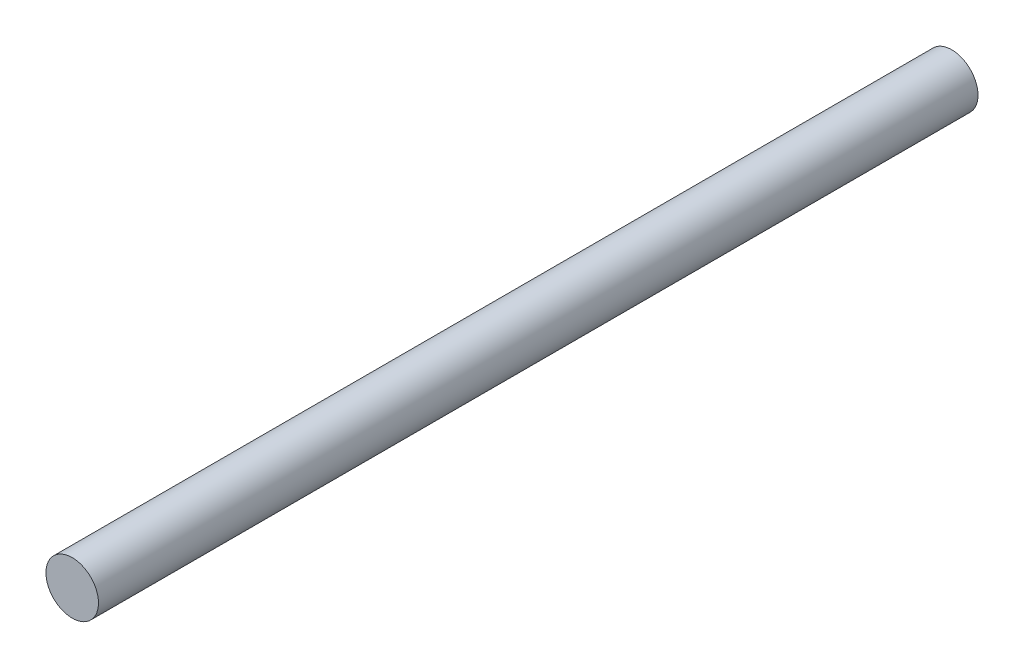
ISO-10303-21;
HEADER;
FILE_DESCRIPTION(('STEP AP214'),'2;1');
FILE_NAME('part.step','',(''),(''),'','','');
FILE_SCHEMA(('AUTOMOTIVE_DESIGN { 1 0 10303 214 1 1 1 1 }'));
ENDSEC;
DATA;
#1=APPLICATION_CONTEXT('core data for automotive mechanical design processes');
#2=APPLICATION_PROTOCOL_DEFINITION('international standard','automotive_design',2000,#1);
#3=PRODUCT_CONTEXT('',#1,'mechanical');
#4=PRODUCT('Part','Part','',(#3));
#5=PRODUCT_RELATED_PRODUCT_CATEGORY('part','',(#4));
#6=PRODUCT_DEFINITION_FORMATION('','',#4);
#7=PRODUCT_DEFINITION_CONTEXT('part definition',#1,'design');
#8=PRODUCT_DEFINITION('design','',#6,#7);
#9=PRODUCT_DEFINITION_SHAPE('','',#8);
#10=(LENGTH_UNIT() NAMED_UNIT(*) SI_UNIT(.MILLI.,.METRE.));
#11=(NAMED_UNIT(*) PLANE_ANGLE_UNIT() SI_UNIT($,.RADIAN.));
#12=(NAMED_UNIT(*) SI_UNIT($,.STERADIAN.) SOLID_ANGLE_UNIT());
#13=UNCERTAINTY_MEASURE_WITH_UNIT(LENGTH_MEASURE(1.E-05),#10,'distance_accuracy_value','');
#14=(GEOMETRIC_REPRESENTATION_CONTEXT(3) GLOBAL_UNCERTAINTY_ASSIGNED_CONTEXT((#13)) GLOBAL_UNIT_ASSIGNED_CONTEXT((#10,
#11,#12)) REPRESENTATION_CONTEXT('',''));
#15=CARTESIAN_POINT('',(0.,0.,0.));
#16=DIRECTION('',(0.,0.,1.));
#17=DIRECTION('',(1.,0.,0.));
#18=AXIS2_PLACEMENT_3D('',#15,#16,#17);
#19=CARTESIAN_POINT('',(0.,0.,335.));
#20=DIRECTION('',(0.,0.,-1.));
#21=DIRECTION('',(-1.,0.,0.));
#22=AXIS2_PLACEMENT_3D('',#19,#20,#21);
#23=CYLINDRICAL_SURFACE('',#22,20.);
#24=CARTESIAN_POINT('',(0.,0.,335.));
#25=DIRECTION('',(0.,0.,1.));
#26=DIRECTION('',(1.,0.,0.));
#27=AXIS2_PLACEMENT_3D('',#24,#25,#26);
#28=CIRCLE('',#27,20.);
#29=CARTESIAN_POINT('',(20.,0.,335.));
#30=VERTEX_POINT('',#29);
#31=EDGE_CURVE('E10',#30,#30,#28,.T.);
#32=ORIENTED_EDGE('',*,*,#31,.F.);
#33=EDGE_LOOP('',(#32));
#34=FACE_BOUND('',#33,.T.);
#35=CARTESIAN_POINT('',(0.,0.,-335.));
#36=DIRECTION('',(0.,0.,1.));
#37=DIRECTION('',(1.,0.,0.));
#38=AXIS2_PLACEMENT_3D('',#35,#36,#37);
#39=CIRCLE('',#38,20.);
#40=CARTESIAN_POINT('',(20.,0.,-335.));
#41=VERTEX_POINT('',#40);
#42=EDGE_CURVE('E37',#41,#41,#39,.T.);
#43=ORIENTED_EDGE('',*,*,#42,.T.);
#44=EDGE_LOOP('',(#43));
#45=FACE_BOUND('',#44,.T.);
#46=ADVANCED_FACE('F34',(#34,#45),#23,.T.);
#47=CARTESIAN_POINT('',(0.,0.,335.));
#48=DIRECTION('',(0.,0.,1.));
#49=DIRECTION('',(1.,0.,0.));
#50=AXIS2_PLACEMENT_3D('',#47,#48,#49);
#51=PLANE('',#50);
#52=ORIENTED_EDGE('',*,*,#31,.T.);
#53=EDGE_LOOP('',(#52));
#54=FACE_BOUND('',#53,.T.);
#55=ADVANCED_FACE('F49',(#54),#51,.T.);
#56=CARTESIAN_POINT('',(0.,0.,-335.));
#57=DIRECTION('',(0.,0.,1.));
#58=DIRECTION('',(1.,0.,0.));
#59=AXIS2_PLACEMENT_3D('',#56,#57,#58);
#60=PLANE('',#59);
#61=ORIENTED_EDGE('',*,*,#42,.F.);
#62=EDGE_LOOP('',(#61));
#63=FACE_BOUND('',#62,.T.);
#64=ADVANCED_FACE('F47',(#63),#60,.F.);
#65=CLOSED_SHELL('',(#46,#55,#64));
#66=MANIFOLD_SOLID_BREP('B2',#65);
#67=ADVANCED_BREP_SHAPE_REPRESENTATION('',(#18,#66),#14);
#68=SHAPE_DEFINITION_REPRESENTATION(#9,#67);
ENDSEC;
END-ISO-10303-21;
